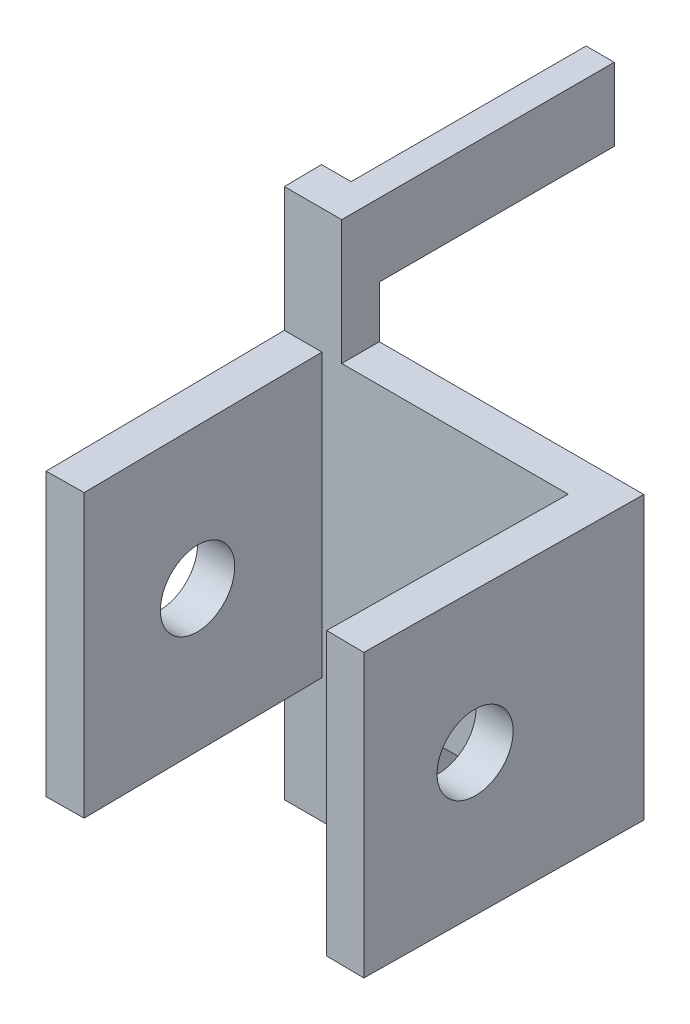
ISO-10303-21;
HEADER;
FILE_DESCRIPTION(('STEP AP214'),'2;1');
FILE_NAME('part.step','',(''),(''),'','','');
FILE_SCHEMA(('AUTOMOTIVE_DESIGN { 1 0 10303 214 1 1 1 1 }'));
ENDSEC;
DATA;
#1=APPLICATION_CONTEXT('core data for automotive mechanical design processes');
#2=APPLICATION_PROTOCOL_DEFINITION('international standard','automotive_design',2000,#1);
#3=PRODUCT_CONTEXT('',#1,'mechanical');
#4=PRODUCT('Part','Part','',(#3));
#5=PRODUCT_RELATED_PRODUCT_CATEGORY('part','',(#4));
#6=PRODUCT_DEFINITION_FORMATION('','',#4);
#7=PRODUCT_DEFINITION_CONTEXT('part definition',#1,'design');
#8=PRODUCT_DEFINITION('design','',#6,#7);
#9=PRODUCT_DEFINITION_SHAPE('','',#8);
#10=(LENGTH_UNIT() NAMED_UNIT(*) SI_UNIT(.MILLI.,.METRE.));
#11=(NAMED_UNIT(*) PLANE_ANGLE_UNIT() SI_UNIT($,.RADIAN.));
#12=(NAMED_UNIT(*) SI_UNIT($,.STERADIAN.) SOLID_ANGLE_UNIT());
#13=UNCERTAINTY_MEASURE_WITH_UNIT(LENGTH_MEASURE(1.E-05),#10,'distance_accuracy_value','');
#14=(GEOMETRIC_REPRESENTATION_CONTEXT(3) GLOBAL_UNCERTAINTY_ASSIGNED_CONTEXT((#13)) GLOBAL_UNIT_ASSIGNED_CONTEXT((#10,
#11,#12)) REPRESENTATION_CONTEXT('',''));
#15=CARTESIAN_POINT('',(0.,0.,0.));
#16=DIRECTION('',(0.,0.,1.));
#17=DIRECTION('',(1.,0.,0.));
#18=AXIS2_PLACEMENT_3D('',#15,#16,#17);
#19=CARTESIAN_POINT('',(0.,30.,0.));
#20=DIRECTION('',(0.,1.,0.));
#21=DIRECTION('',(0.,0.,1.));
#22=AXIS2_PLACEMENT_3D('',#19,#20,#21);
#23=PLANE('',#22);
#24=DIRECTION('',(1.,0.,0.));
#25=VECTOR('',#24,1.);
#26=CARTESIAN_POINT('',(0.,30.,-12.8));
#27=LINE('',#26,#25);
#28=CARTESIAN_POINT('',(-17.1002746487741,30.,-12.8));
#29=VERTEX_POINT('',#28);
#30=CARTESIAN_POINT('',(-13.1,30.,-12.8));
#31=VERTEX_POINT('',#30);
#32=EDGE_CURVE('E210',#29,#31,#27,.T.);
#33=ORIENTED_EDGE('',*,*,#32,.F.);
#34=DIRECTION('',(0.0117179454201639,0.,0.99993134252064));
#35=VECTOR('',#34,1.);
#36=CARTESIAN_POINT('',(-16.7997253700826,30.,12.8468717816807));
#37=LINE('',#36,#35);
#38=CARTESIAN_POINT('',(-16.7997253700826,30.,12.8468717816807));
#39=VERTEX_POINT('',#38);
#40=EDGE_CURVE('E252',#29,#39,#37,.T.);
#41=ORIENTED_EDGE('',*,*,#40,.T.);
#42=DIRECTION('',(0.999931342520641,0.,-0.0117179454201641));
#43=VECTOR('',#42,1.);
#44=CARTESIAN_POINT('',(-16.7997253700826,30.,12.8468717816807));
#45=LINE('',#44,#43);
#46=CARTESIAN_POINT('',(-12.8,30.,12.8));
#47=VERTEX_POINT('',#46);
#48=EDGE_CURVE('E236',#39,#47,#45,.T.);
#49=ORIENTED_EDGE('',*,*,#48,.T.);
#50=DIRECTION('',(-0.0117179454201639,0.,-0.99993134252064));
#51=VECTOR('',#50,1.);
#52=CARTESIAN_POINT('',(-12.8,30.,12.8));
#53=LINE('',#52,#51);
#54=EDGE_CURVE('E239',#47,#31,#53,.T.);
#55=ORIENTED_EDGE('',*,*,#54,.T.);
#56=EDGE_LOOP('',(#33,#41,#49,#55));
#57=FACE_BOUND('',#56,.T.);
#58=ADVANCED_FACE('F33',(#57),#23,.T.);
#59=CARTESIAN_POINT('',(0.,0.,0.));
#60=DIRECTION('',(0.,1.,0.));
#61=DIRECTION('',(0.,0.,1.));
#62=AXIS2_PLACEMENT_3D('',#59,#60,#61);
#63=PLANE('',#62);
#64=DIRECTION('',(0.0117179454201639,0.,0.99993134252064));
#65=VECTOR('',#64,1.);
#66=CARTESIAN_POINT('',(-16.7997253700826,0.,12.8468717816807));
#67=LINE('',#66,#65);
#68=CARTESIAN_POINT('',(-17.1002746487741,0.,-12.8));
#69=VERTEX_POINT('',#68);
#70=CARTESIAN_POINT('',(-16.7997253700826,0.,12.8468717816807));
#71=VERTEX_POINT('',#70);
#72=EDGE_CURVE('E240',#69,#71,#67,.T.);
#73=ORIENTED_EDGE('',*,*,#72,.F.);
#74=DIRECTION('',(1.,0.,0.));
#75=VECTOR('',#74,1.);
#76=CARTESIAN_POINT('',(0.,0.,-12.8));
#77=LINE('',#76,#75);
#78=CARTESIAN_POINT('',(-13.1,0.,-12.8));
#79=VERTEX_POINT('',#78);
#80=EDGE_CURVE('E41',#69,#79,#77,.T.);
#81=ORIENTED_EDGE('',*,*,#80,.T.);
#82=DIRECTION('',(-0.0117179454201639,0.,-0.99993134252064));
#83=VECTOR('',#82,1.);
#84=CARTESIAN_POINT('',(-12.8,0.,12.8));
#85=LINE('',#84,#83);
#86=CARTESIAN_POINT('',(-12.8,0.,12.8));
#87=VERTEX_POINT('',#86);
#88=EDGE_CURVE('E257',#87,#79,#85,.T.);
#89=ORIENTED_EDGE('',*,*,#88,.F.);
#90=DIRECTION('',(0.999931342520641,0.,-0.0117179454201641));
#91=VECTOR('',#90,1.);
#92=CARTESIAN_POINT('',(-16.7997253700826,0.,12.8468717816807));
#93=LINE('',#92,#91);
#94=EDGE_CURVE('E235',#71,#87,#93,.T.);
#95=ORIENTED_EDGE('',*,*,#94,.F.);
#96=EDGE_LOOP('',(#73,#81,#89,#95));
#97=FACE_BOUND('',#96,.T.);
#98=ADVANCED_FACE('F294',(#97),#63,.F.);
#99=CARTESIAN_POINT('',(-13.9998132817287,35.5,-12.8));
#100=DIRECTION('',(-1.,0.,0.));
#101=DIRECTION('',(0.,0.,1.));
#102=AXIS2_PLACEMENT_3D('',#99,#100,#101);
#103=PLANE('',#102);
#104=DIRECTION('',(0.,0.,1.));
#105=VECTOR('',#104,1.);
#106=CARTESIAN_POINT('',(-13.9998132817287,-13.25,-41.8));
#107=LINE('',#106,#105);
#108=CARTESIAN_POINT('',(-13.9998132817287,-13.25,-41.8));
#109=VERTEX_POINT('',#108);
#110=CARTESIAN_POINT('',(-13.9998132817287,-13.25,-16.8));
#111=VERTEX_POINT('',#110);
#112=EDGE_CURVE('E55',#109,#111,#107,.T.);
#113=ORIENTED_EDGE('',*,*,#112,.T.);
#114=DIRECTION('',(0.,-1.,0.));
#115=VECTOR('',#114,1.);
#116=CARTESIAN_POINT('',(-13.9998132817287,43.25,-16.8));
#117=LINE('',#116,#115);
#118=CARTESIAN_POINT('',(-13.9998132817287,-5.5,-16.8));
#119=VERTEX_POINT('',#118);
#120=EDGE_CURVE('E193',#119,#111,#117,.T.);
#121=ORIENTED_EDGE('',*,*,#120,.F.);
#122=DIRECTION('',(0.,0.,1.));
#123=VECTOR('',#122,1.);
#124=CARTESIAN_POINT('',(-13.9998132817287,-5.50000000000001,-41.8));
#125=LINE('',#124,#123);
#126=CARTESIAN_POINT('',(-13.9998132817287,-5.50000000000001,-41.8));
#127=VERTEX_POINT('',#126);
#128=EDGE_CURVE('E336',#127,#119,#125,.T.);
#129=ORIENTED_EDGE('',*,*,#128,.F.);
#130=DIRECTION('',(0.,1.,0.));
#131=VECTOR('',#130,1.);
#132=CARTESIAN_POINT('',(-13.9998132817287,-5.50000000000001,-41.8));
#133=LINE('',#132,#131);
#134=EDGE_CURVE('E329',#109,#127,#133,.T.);
#135=ORIENTED_EDGE('',*,*,#134,.F.);
#136=EDGE_LOOP('',(#113,#121,#129,#135));
#137=FACE_BOUND('',#136,.T.);
#138=ADVANCED_FACE('F417',(#137),#103,.T.);
#139=DIRECTION('',(0.,0.,1.));
#140=VECTOR('',#139,1.);
#141=CARTESIAN_POINT('',(-13.9998132817287,35.5,-41.8));
#142=LINE('',#141,#140);
#143=CARTESIAN_POINT('',(-13.9998132817287,35.5,-41.8));
#144=VERTEX_POINT('',#143);
#145=CARTESIAN_POINT('',(-13.9998132817287,35.5,-16.8));
#146=VERTEX_POINT('',#145);
#147=EDGE_CURVE('E192',#144,#146,#142,.T.);
#148=ORIENTED_EDGE('',*,*,#147,.T.);
#149=CARTESIAN_POINT('',(-13.9998132817287,43.25,-16.8));
#150=VERTEX_POINT('',#149);
#151=EDGE_CURVE('E174',#150,#146,#117,.T.);
#152=ORIENTED_EDGE('',*,*,#151,.F.);
#153=DIRECTION('',(0.,0.,1.));
#154=VECTOR('',#153,1.);
#155=CARTESIAN_POINT('',(-13.9998132817287,43.25,-41.8));
#156=LINE('',#155,#154);
#157=CARTESIAN_POINT('',(-13.9998132817287,43.25,-41.8));
#158=VERTEX_POINT('',#157);
#159=EDGE_CURVE('E189',#158,#150,#156,.T.);
#160=ORIENTED_EDGE('',*,*,#159,.F.);
#161=DIRECTION('',(0.,1.,0.));
#162=VECTOR('',#161,1.);
#163=CARTESIAN_POINT('',(-13.9998132817287,35.5,-41.8));
#164=LINE('',#163,#162);
#165=EDGE_CURVE('E349',#144,#158,#164,.T.);
#166=ORIENTED_EDGE('',*,*,#165,.F.);
#167=EDGE_LOOP('',(#148,#152,#160,#166));
#168=FACE_BOUND('',#167,.T.);
#169=ADVANCED_FACE('F188',(#168),#103,.T.);
#170=DIRECTION('',(0.,0.,-1.));
#171=VECTOR('',#170,1.);
#172=CARTESIAN_POINT('',(-10.9998132817287,30.,0.));
#173=LINE('',#172,#171);
#174=CARTESIAN_POINT('',(-10.9998132817287,30.,-12.8));
#175=VERTEX_POINT('',#174);
#176=CARTESIAN_POINT('',(-10.9998132817287,30.,-16.8));
#177=VERTEX_POINT('',#176);
#178=EDGE_CURVE('E222',#175,#177,#173,.T.);
#179=ORIENTED_EDGE('',*,*,#178,.F.);
#180=DIRECTION('',(1.,0.,0.));
#181=VECTOR('',#180,1.);
#182=CARTESIAN_POINT('',(-13.1,30.,-12.8));
#183=LINE('',#182,#181);
#184=CARTESIAN_POINT('',(13.1,30.,-12.8));
#185=VERTEX_POINT('',#184);
#186=EDGE_CURVE('E242',#175,#185,#183,.T.);
#187=ORIENTED_EDGE('',*,*,#186,.T.);
#188=DIRECTION('',(-0.0118101998876842,0.,0.999930257157274));
#189=VECTOR('',#188,1.);
#190=CARTESIAN_POINT('',(13.1,30.,-12.8));
#191=LINE('',#190,#189);
#192=CARTESIAN_POINT('',(12.8,30.,12.6));
#193=VERTEX_POINT('',#192);
#194=EDGE_CURVE('E244',#185,#193,#191,.T.);
#195=ORIENTED_EDGE('',*,*,#194,.T.);
#196=DIRECTION('',(0.999930257157274,0.,0.0118101998876842));
#197=VECTOR('',#196,1.);
#198=CARTESIAN_POINT('',(12.8,30.,12.6));
#199=LINE('',#198,#197);
#200=CARTESIAN_POINT('',(16.7997210286291,30.,12.6472407995507));
#201=VERTEX_POINT('',#200);
#202=EDGE_CURVE('E246',#193,#201,#199,.T.);
#203=ORIENTED_EDGE('',*,*,#202,.T.);
#204=DIRECTION('',(0.0118101998876842,0.,-0.999930257157274));
#205=VECTOR('',#204,1.);
#206=CARTESIAN_POINT('',(17.1475230853167,30.,-16.8));
#207=LINE('',#206,#205);
#208=CARTESIAN_POINT('',(17.1475230853167,30.,-16.8));
#209=VERTEX_POINT('',#208);
#210=EDGE_CURVE('E248',#201,#209,#207,.T.);
#211=ORIENTED_EDGE('',*,*,#210,.T.);
#212=DIRECTION('',(-1.,0.,0.));
#213=VECTOR('',#212,1.);
#214=CARTESIAN_POINT('',(-17.1471496487741,30.,-16.8));
#215=LINE('',#214,#213);
#216=EDGE_CURVE('E250',#209,#177,#215,.T.);
#217=ORIENTED_EDGE('',*,*,#216,.T.);
#218=EDGE_LOOP('',(#179,#187,#195,#203,#211,#217));
#219=FACE_BOUND('',#218,.T.);
#220=ADVANCED_FACE('F363',(#219),#23,.T.);
#221=DIRECTION('',(1.,0.,0.));
#222=VECTOR('',#221,1.);
#223=CARTESIAN_POINT('',(-13.1,0.,-12.8));
#224=LINE('',#223,#222);
#225=CARTESIAN_POINT('',(-10.9998132817287,0.,-12.8));
#226=VERTEX_POINT('',#225);
#227=CARTESIAN_POINT('',(13.1,0.,-12.8));
#228=VERTEX_POINT('',#227);
#229=EDGE_CURVE('E260',#226,#228,#224,.T.);
#230=ORIENTED_EDGE('',*,*,#229,.F.);
#231=DIRECTION('',(0.,0.,-1.));
#232=VECTOR('',#231,1.);
#233=CARTESIAN_POINT('',(-10.9998132817287,0.,0.));
#234=LINE('',#233,#232);
#235=CARTESIAN_POINT('',(-10.9998132817287,0.,-16.8));
#236=VERTEX_POINT('',#235);
#237=EDGE_CURVE('E11',#226,#236,#234,.T.);
#238=ORIENTED_EDGE('',*,*,#237,.T.);
#239=DIRECTION('',(-1.,0.,0.));
#240=VECTOR('',#239,1.);
#241=CARTESIAN_POINT('',(-17.1471496487741,0.,-16.8));
#242=LINE('',#241,#240);
#243=CARTESIAN_POINT('',(17.1475230853167,0.,-16.8));
#244=VERTEX_POINT('',#243);
#245=EDGE_CURVE('E268',#244,#236,#242,.T.);
#246=ORIENTED_EDGE('',*,*,#245,.F.);
#247=DIRECTION('',(0.0118101998876842,0.,-0.999930257157274));
#248=VECTOR('',#247,1.);
#249=CARTESIAN_POINT('',(17.1475230853167,0.,-16.8));
#250=LINE('',#249,#248);
#251=CARTESIAN_POINT('',(16.7997210286291,0.,12.6472407995507));
#252=VERTEX_POINT('',#251);
#253=EDGE_CURVE('E266',#252,#244,#250,.T.);
#254=ORIENTED_EDGE('',*,*,#253,.F.);
#255=DIRECTION('',(0.999930257157274,0.,0.0118101998876842));
#256=VECTOR('',#255,1.);
#257=CARTESIAN_POINT('',(12.8,0.,12.6));
#258=LINE('',#257,#256);
#259=CARTESIAN_POINT('',(12.8,0.,12.6));
#260=VERTEX_POINT('',#259);
#261=EDGE_CURVE('E264',#260,#252,#258,.T.);
#262=ORIENTED_EDGE('',*,*,#261,.F.);
#263=DIRECTION('',(-0.0118101998876842,0.,0.999930257157274));
#264=VECTOR('',#263,1.);
#265=CARTESIAN_POINT('',(13.1,0.,-12.8));
#266=LINE('',#265,#264);
#267=EDGE_CURVE('E262',#228,#260,#266,.T.);
#268=ORIENTED_EDGE('',*,*,#267,.F.);
#269=EDGE_LOOP('',(#230,#238,#246,#254,#262,#268));
#270=FACE_BOUND('',#269,.T.);
#271=ADVANCED_FACE('F385',(#270),#63,.F.);
#272=CARTESIAN_POINT('',(-16.7997253700826,30.,12.8468717816807));
#273=DIRECTION('',(-0.0117179454201641,0.,-0.99993134252064));
#274=DIRECTION('',(-0.99993134252064,0.,0.0117179454201641));
#275=AXIS2_PLACEMENT_3D('',#272,#273,#274);
#276=PLANE('',#275);
#277=ORIENTED_EDGE('',*,*,#94,.T.);
#278=DIRECTION('',(0.,-1.,0.));
#279=VECTOR('',#278,1.);
#280=CARTESIAN_POINT('',(-12.8,30.,12.8));
#281=LINE('',#280,#279);
#282=EDGE_CURVE('E289',#47,#87,#281,.T.);
#283=ORIENTED_EDGE('',*,*,#282,.F.);
#284=ORIENTED_EDGE('',*,*,#48,.F.);
#285=DIRECTION('',(0.,-1.,0.));
#286=VECTOR('',#285,1.);
#287=CARTESIAN_POINT('',(-16.7997253700826,30.,12.8468717816807));
#288=LINE('',#287,#286);
#289=EDGE_CURVE('E254',#39,#71,#288,.T.);
#290=ORIENTED_EDGE('',*,*,#289,.T.);
#291=EDGE_LOOP('',(#277,#283,#284,#290));
#292=FACE_BOUND('',#291,.T.);
#293=ADVANCED_FACE('F35',(#292),#276,.F.);
#294=CARTESIAN_POINT('',(-12.8,30.,12.8));
#295=DIRECTION('',(-0.99993134252064,0.,0.0117179454201639));
#296=DIRECTION('',(0.0117179454201639,0.,0.99993134252064));
#297=AXIS2_PLACEMENT_3D('',#294,#295,#296);
#298=PLANE('',#297);
#299=CARTESIAN_POINT('',(-12.9430257914129,15.,0.595132466101247));
#300=DIRECTION('',(-0.99993134252064,0.,0.0117179454201639));
#301=DIRECTION('',(0.0117179454201639,0.,0.99993134252064));
#302=AXIS2_PLACEMENT_3D('',#299,#300,#301);
#303=ELLIPSE('',#302,4.00110745377421,4.);
#304=CARTESIAN_POINT('',(-12.8961410326493,15.,4.59596521392304));
#305=VERTEX_POINT('',#304);
#306=EDGE_CURVE('E232',#305,#305,#303,.T.);
#307=ORIENTED_EDGE('',*,*,#306,.T.);
#308=EDGE_LOOP('',(#307));
#309=FACE_BOUND('',#308,.T.);
#310=ORIENTED_EDGE('',*,*,#88,.T.);
#311=DIRECTION('',(0.,-1.,0.));
#312=VECTOR('',#311,1.);
#313=CARTESIAN_POINT('',(-13.1,30.,-12.8));
#314=LINE('',#313,#312);
#315=EDGE_CURVE('E287',#31,#79,#314,.T.);
#316=ORIENTED_EDGE('',*,*,#315,.F.);
#317=ORIENTED_EDGE('',*,*,#54,.F.);
#318=ORIENTED_EDGE('',*,*,#282,.T.);
#319=EDGE_LOOP('',(#310,#316,#317,#318));
#320=FACE_BOUND('',#319,.T.);
#321=ADVANCED_FACE('F299',(#309,#320),#298,.F.);
#322=CARTESIAN_POINT('',(-13.1,30.,-12.8));
#323=DIRECTION('',(0.,0.,-1.));
#324=DIRECTION('',(-1.,0.,0.));
#325=AXIS2_PLACEMENT_3D('',#322,#323,#324);
#326=PLANE('',#325);
#327=ORIENTED_EDGE('',*,*,#186,.F.);
#328=DIRECTION('',(0.,-1.,0.));
#329=VECTOR('',#328,1.);
#330=CARTESIAN_POINT('',(-10.9998132817287,-5.5,-12.8));
#331=LINE('',#330,#329);
#332=CARTESIAN_POINT('',(-10.9998132817287,43.25,-12.8));
#333=VERTEX_POINT('',#332);
#334=EDGE_CURVE('E207',#333,#175,#331,.T.);
#335=ORIENTED_EDGE('',*,*,#334,.F.);
#336=DIRECTION('',(1.,0.,0.));
#337=VECTOR('',#336,1.);
#338=CARTESIAN_POINT('',(-10.9998132817287,43.25,-12.8));
#339=LINE('',#338,#337);
#340=CARTESIAN_POINT('',(-17.1002746487741,43.25,-12.8));
#341=VERTEX_POINT('',#340);
#342=EDGE_CURVE('E343',#341,#333,#339,.T.);
#343=ORIENTED_EDGE('',*,*,#342,.F.);
#344=DIRECTION('',(0.,-1.,0.));
#345=VECTOR('',#344,1.);
#346=CARTESIAN_POINT('',(-17.1002746487741,-13.25,-12.8));
#347=LINE('',#346,#345);
#348=EDGE_CURVE('E305',#341,#29,#347,.T.);
#349=ORIENTED_EDGE('',*,*,#348,.T.);
#350=ORIENTED_EDGE('',*,*,#32,.T.);
#351=ORIENTED_EDGE('',*,*,#315,.T.);
#352=ORIENTED_EDGE('',*,*,#80,.F.);
#353=CARTESIAN_POINT('',(-17.1002746487741,-13.25,-12.8));
#354=VERTEX_POINT('',#353);
#355=EDGE_CURVE('E182',#69,#354,#347,.T.);
#356=ORIENTED_EDGE('',*,*,#355,.T.);
#357=DIRECTION('',(-1.,0.,0.));
#358=VECTOR('',#357,1.);
#359=CARTESIAN_POINT('',(-10.9998132817287,-13.25,-12.8));
#360=LINE('',#359,#358);
#361=CARTESIAN_POINT('',(-10.9998132817287,-13.25,-12.8));
#362=VERTEX_POINT('',#361);
#363=EDGE_CURVE('E321',#362,#354,#360,.T.);
#364=ORIENTED_EDGE('',*,*,#363,.F.);
#365=EDGE_CURVE('E211',#226,#362,#331,.T.);
#366=ORIENTED_EDGE('',*,*,#365,.F.);
#367=ORIENTED_EDGE('',*,*,#229,.T.);
#368=DIRECTION('',(0.,-1.,0.));
#369=VECTOR('',#368,1.);
#370=CARTESIAN_POINT('',(13.1,30.,-12.8));
#371=LINE('',#370,#369);
#372=EDGE_CURVE('E284',#185,#228,#371,.T.);
#373=ORIENTED_EDGE('',*,*,#372,.F.);
#374=EDGE_LOOP('',(#327,#335,#343,#349,#350,#351,#352,#356,#364,#366,#367,#373));
#375=FACE_BOUND('',#374,.T.);
#376=ADVANCED_FACE('F302',(#375),#326,.F.);
#377=CARTESIAN_POINT('',(13.1,30.,-12.8));
#378=DIRECTION('',(0.999930257157274,0.,0.0118101998876842));
#379=DIRECTION('',(0.0118101998876842,0.,-0.999930257157275));
#380=AXIS2_PLACEMENT_3D('',#377,#378,#379);
#381=PLANE('',#380);
#382=CARTESIAN_POINT('',(12.9381793386859,15.,0.900815991259892));
#383=DIRECTION('',(0.999930257157274,0.,0.0118101998876842));
#384=DIRECTION('',(0.0118101998876842,0.,-0.999930257157275));
#385=AXIS2_PLACEMENT_3D('',#382,#383,#384);
#386=CIRCLE('',#385,4.);
#387=CARTESIAN_POINT('',(12.9854201382366,15.,-3.09890503736921));
#388=VERTEX_POINT('',#387);
#389=EDGE_CURVE('E229',#388,#388,#386,.T.);
#390=ORIENTED_EDGE('',*,*,#389,.T.);
#391=EDGE_LOOP('',(#390));
#392=FACE_BOUND('',#391,.T.);
#393=ORIENTED_EDGE('',*,*,#267,.T.);
#394=DIRECTION('',(0.,-1.,0.));
#395=VECTOR('',#394,1.);
#396=CARTESIAN_POINT('',(12.8,30.,12.6));
#397=LINE('',#396,#395);
#398=EDGE_CURVE('E281',#193,#260,#397,.T.);
#399=ORIENTED_EDGE('',*,*,#398,.F.);
#400=ORIENTED_EDGE('',*,*,#194,.F.);
#401=ORIENTED_EDGE('',*,*,#372,.T.);
#402=EDGE_LOOP('',(#393,#399,#400,#401));
#403=FACE_BOUND('',#402,.T.);
#404=ADVANCED_FACE('F371',(#392,#403),#381,.F.);
#405=CARTESIAN_POINT('',(12.8,30.,12.6));
#406=DIRECTION('',(0.0118101998876842,0.,-0.999930257157274));
#407=DIRECTION('',(-0.999930257157275,0.,-0.0118101998876842));
#408=AXIS2_PLACEMENT_3D('',#405,#406,#407);
#409=PLANE('',#408);
#410=ORIENTED_EDGE('',*,*,#261,.T.);
#411=DIRECTION('',(0.,-1.,0.));
#412=VECTOR('',#411,1.);
#413=CARTESIAN_POINT('',(16.7997210286291,30.,12.6472407995507));
#414=LINE('',#413,#412);
#415=EDGE_CURVE('E278',#201,#252,#414,.T.);
#416=ORIENTED_EDGE('',*,*,#415,.F.);
#417=ORIENTED_EDGE('',*,*,#202,.F.);
#418=ORIENTED_EDGE('',*,*,#398,.T.);
#419=EDGE_LOOP('',(#410,#416,#417,#418));
#420=FACE_BOUND('',#419,.T.);
#421=ADVANCED_FACE('F377',(#420),#409,.F.);
#422=CARTESIAN_POINT('',(17.1475230853167,30.,-16.8));
#423=DIRECTION('',(-0.999930257157274,0.,-0.0118101998876842));
#424=DIRECTION('',(-0.0118101998876842,0.,0.999930257157275));
#425=AXIS2_PLACEMENT_3D('',#422,#423,#424);
#426=PLANE('',#425);
#427=CARTESIAN_POINT('',(16.937900367315,15.,0.948056790810628));
#428=DIRECTION('',(0.999930257157274,0.,0.0118101998876842));
#429=DIRECTION('',(0.0118101998876842,0.,-0.999930257157274));
#430=AXIS2_PLACEMENT_3D('',#427,#428,#429);
#431=CIRCLE('',#430,4.);
#432=CARTESIAN_POINT('',(16.9851411668657,15.,-3.05166423781847));
#433=VERTEX_POINT('',#432);
#434=EDGE_CURVE('E225',#433,#433,#431,.T.);
#435=ORIENTED_EDGE('',*,*,#434,.F.);
#436=EDGE_LOOP('',(#435));
#437=FACE_BOUND('',#436,.T.);
#438=ORIENTED_EDGE('',*,*,#253,.T.);
#439=DIRECTION('',(0.,-1.,0.));
#440=VECTOR('',#439,1.);
#441=CARTESIAN_POINT('',(17.1475230853167,30.,-16.8));
#442=LINE('',#441,#440);
#443=EDGE_CURVE('E275',#209,#244,#442,.T.);
#444=ORIENTED_EDGE('',*,*,#443,.F.);
#445=ORIENTED_EDGE('',*,*,#210,.F.);
#446=ORIENTED_EDGE('',*,*,#415,.T.);
#447=EDGE_LOOP('',(#438,#444,#445,#446));
#448=FACE_BOUND('',#447,.T.);
#449=ADVANCED_FACE('F381',(#437,#448),#426,.F.);
#450=CARTESIAN_POINT('',(-17.1471496487741,30.,-16.8));
#451=DIRECTION('',(0.,0.,1.));
#452=DIRECTION('',(1.,0.,0.));
#453=AXIS2_PLACEMENT_3D('',#450,#451,#452);
#454=PLANE('',#453);
#455=DIRECTION('',(0.,-1.,0.));
#456=VECTOR('',#455,1.);
#457=CARTESIAN_POINT('',(-17.1471496487741,30.,-16.8));
#458=LINE('',#457,#456);
#459=CARTESIAN_POINT('',(-17.1471496487741,43.25,-16.8));
#460=VERTEX_POINT('',#459);
#461=CARTESIAN_POINT('',(-17.1471496487741,-13.25,-16.8));
#462=VERTEX_POINT('',#461);
#463=EDGE_CURVE('E177',#460,#462,#458,.T.);
#464=ORIENTED_EDGE('',*,*,#463,.F.);
#465=DIRECTION('',(1.,0.,0.));
#466=VECTOR('',#465,1.);
#467=CARTESIAN_POINT('',(-73.7670726534593,43.25,-16.8));
#468=LINE('',#467,#466);
#469=EDGE_CURVE('E170',#460,#150,#468,.T.);
#470=ORIENTED_EDGE('',*,*,#469,.T.);
#471=ORIENTED_EDGE('',*,*,#151,.T.);
#472=DIRECTION('',(1.,0.,0.));
#473=VECTOR('',#472,1.);
#474=CARTESIAN_POINT('',(-10.9998132817287,35.5,-16.8));
#475=LINE('',#474,#473);
#476=CARTESIAN_POINT('',(-10.9998132817287,35.5,-16.8));
#477=VERTEX_POINT('',#476);
#478=EDGE_CURVE('E214',#146,#477,#475,.T.);
#479=ORIENTED_EDGE('',*,*,#478,.T.);
#480=DIRECTION('',(0.,-1.,0.));
#481=VECTOR('',#480,1.);
#482=CARTESIAN_POINT('',(-10.9998132817287,-5.5,-16.8));
#483=LINE('',#482,#481);
#484=EDGE_CURVE('E217',#477,#177,#483,.T.);
#485=ORIENTED_EDGE('',*,*,#484,.T.);
#486=ORIENTED_EDGE('',*,*,#216,.F.);
#487=ORIENTED_EDGE('',*,*,#443,.T.);
#488=ORIENTED_EDGE('',*,*,#245,.T.);
#489=CARTESIAN_POINT('',(-10.9998132817287,-5.50000000000001,-16.8));
#490=VERTEX_POINT('',#489);
#491=EDGE_CURVE('E216',#236,#490,#483,.T.);
#492=ORIENTED_EDGE('',*,*,#491,.T.);
#493=DIRECTION('',(-1.,0.,0.));
#494=VECTOR('',#493,1.);
#495=CARTESIAN_POINT('',(-10.9998132817287,-5.5,-16.8));
#496=LINE('',#495,#494);
#497=EDGE_CURVE('E200',#490,#119,#496,.T.);
#498=ORIENTED_EDGE('',*,*,#497,.T.);
#499=ORIENTED_EDGE('',*,*,#120,.T.);
#500=DIRECTION('',(1.,0.,0.));
#501=VECTOR('',#500,1.);
#502=CARTESIAN_POINT('',(-73.7670726534593,-13.25,-16.8));
#503=LINE('',#502,#501);
#504=EDGE_CURVE('E183',#462,#111,#503,.T.);
#505=ORIENTED_EDGE('',*,*,#504,.F.);
#506=EDGE_LOOP('',(#464,#470,#471,#479,#485,#486,#487,#488,#492,#498,#499,#505));
#507=FACE_BOUND('',#506,.T.);
#508=ADVANCED_FACE('F172',(#507),#454,.F.);
#509=CARTESIAN_POINT('',(-16.7997253700826,30.,12.8468717816807));
#510=DIRECTION('',(0.99993134252064,0.,-0.0117179454201639));
#511=DIRECTION('',(-0.0117179454201639,0.,-0.99993134252064));
#512=AXIS2_PLACEMENT_3D('',#509,#510,#511);
#513=PLANE('',#512);
#514=ORIENTED_EDGE('',*,*,#463,.T.);
#515=DIRECTION('',(-0.0117179454201639,0.,-0.99993134252064));
#516=VECTOR('',#515,1.);
#517=CARTESIAN_POINT('',(-17.1080555806842,-13.25,-13.4639728563216));
#518=LINE('',#517,#516);
#519=EDGE_CURVE('E316',#354,#462,#518,.T.);
#520=ORIENTED_EDGE('',*,*,#519,.F.);
#521=ORIENTED_EDGE('',*,*,#355,.F.);
#522=ORIENTED_EDGE('',*,*,#72,.T.);
#523=ORIENTED_EDGE('',*,*,#289,.F.);
#524=ORIENTED_EDGE('',*,*,#40,.F.);
#525=ORIENTED_EDGE('',*,*,#348,.F.);
#526=DIRECTION('',(0.0117179454201639,0.,0.99993134252064));
#527=VECTOR('',#526,1.);
#528=CARTESIAN_POINT('',(-17.1080555806842,43.25,-13.4639728563216));
#529=LINE('',#528,#527);
#530=EDGE_CURVE('E324',#460,#341,#529,.T.);
#531=ORIENTED_EDGE('',*,*,#530,.F.);
#532=EDGE_LOOP('',(#514,#520,#521,#522,#523,#524,#525,#531));
#533=FACE_BOUND('',#532,.T.);
#534=CARTESIAN_POINT('',(-16.9438541965792,15.,0.547878587300071));
#535=DIRECTION('',(0.99993134252064,0.,-0.0117179454201639));
#536=DIRECTION('',(0.0117179454201639,0.,0.99993134252064));
#537=AXIS2_PLACEMENT_3D('',#534,#535,#536);
#538=ELLIPSE('',#537,4.00110745377421,4.);
#539=CARTESIAN_POINT('',(-16.8969694378157,15.,4.54871133512186));
#540=VERTEX_POINT('',#539);
#541=EDGE_CURVE('E228',#540,#540,#538,.T.);
#542=ORIENTED_EDGE('',*,*,#541,.T.);
#543=EDGE_LOOP('',(#542));
#544=FACE_BOUND('',#543,.T.);
#545=ADVANCED_FACE('F312',(#533,#544),#513,.F.);
#546=CARTESIAN_POINT('',(-23.059309918976,15.,0.475648795303259));
#547=DIRECTION('',(0.999930257157274,0.,0.0118101998876842));
#548=DIRECTION('',(0.0118101998876842,0.,-0.999930257157275));
#549=AXIS2_PLACEMENT_3D('',#546,#547,#548);
#550=CYLINDRICAL_SURFACE('',#549,4.);
#551=ORIENTED_EDGE('',*,*,#541,.F.);
#552=EDGE_LOOP('',(#551));
#553=FACE_BOUND('',#552,.T.);
#554=ORIENTED_EDGE('',*,*,#306,.F.);
#555=EDGE_LOOP('',(#554));
#556=FACE_BOUND('',#555,.T.);
#557=ADVANCED_FACE('F431',(#553,#556),#550,.F.);
#558=ORIENTED_EDGE('',*,*,#434,.T.);
#559=EDGE_LOOP('',(#558));
#560=FACE_BOUND('',#559,.T.);
#561=ORIENTED_EDGE('',*,*,#389,.F.);
#562=EDGE_LOOP('',(#561));
#563=FACE_BOUND('',#562,.T.);
#564=ADVANCED_FACE('F433',(#560,#563),#550,.F.);
#565=CARTESIAN_POINT('',(-10.9998132817287,-5.5,-12.8));
#566=DIRECTION('',(1.,0.,0.));
#567=DIRECTION('',(0.,1.,0.));
#568=AXIS2_PLACEMENT_3D('',#565,#566,#567);
#569=PLANE('',#568);
#570=ORIENTED_EDGE('',*,*,#237,.F.);
#571=ORIENTED_EDGE('',*,*,#365,.T.);
#572=DIRECTION('',(0.,0.,1.));
#573=VECTOR('',#572,1.);
#574=CARTESIAN_POINT('',(-10.9998132817287,-13.25,-41.8));
#575=LINE('',#574,#573);
#576=CARTESIAN_POINT('',(-10.9998132817287,-13.25,-41.8));
#577=VERTEX_POINT('',#576);
#578=EDGE_CURVE('E340',#577,#362,#575,.T.);
#579=ORIENTED_EDGE('',*,*,#578,.F.);
#580=DIRECTION('',(0.,-1.,0.));
#581=VECTOR('',#580,1.);
#582=CARTESIAN_POINT('',(-10.9998132817287,-5.50000000000001,-41.8));
#583=LINE('',#582,#581);
#584=CARTESIAN_POINT('',(-10.9998132817287,-5.50000000000001,-41.8));
#585=VERTEX_POINT('',#584);
#586=EDGE_CURVE('E323',#585,#577,#583,.T.);
#587=ORIENTED_EDGE('',*,*,#586,.F.);
#588=DIRECTION('',(0.,0.,1.));
#589=VECTOR('',#588,1.);
#590=CARTESIAN_POINT('',(-10.9998132817287,-5.50000000000001,-41.8));
#591=LINE('',#590,#589);
#592=EDGE_CURVE('E333',#585,#490,#591,.T.);
#593=ORIENTED_EDGE('',*,*,#592,.T.);
#594=ORIENTED_EDGE('',*,*,#491,.F.);
#595=EDGE_LOOP('',(#570,#571,#579,#587,#593,#594));
#596=FACE_BOUND('',#595,.T.);
#597=ADVANCED_FACE('F387',(#596),#569,.T.);
#598=ORIENTED_EDGE('',*,*,#334,.T.);
#599=ORIENTED_EDGE('',*,*,#178,.T.);
#600=ORIENTED_EDGE('',*,*,#484,.F.);
#601=DIRECTION('',(0.,0.,1.));
#602=VECTOR('',#601,1.);
#603=CARTESIAN_POINT('',(-10.9998132817287,35.5,-41.8));
#604=LINE('',#603,#602);
#605=CARTESIAN_POINT('',(-10.9998132817287,35.5,-41.8));
#606=VERTEX_POINT('',#605);
#607=EDGE_CURVE('E203',#606,#477,#604,.T.);
#608=ORIENTED_EDGE('',*,*,#607,.F.);
#609=DIRECTION('',(0.,-1.,0.));
#610=VECTOR('',#609,1.);
#611=CARTESIAN_POINT('',(-10.9998132817287,35.5,-41.8));
#612=LINE('',#611,#610);
#613=CARTESIAN_POINT('',(-10.9998132817287,43.25,-41.8));
#614=VERTEX_POINT('',#613);
#615=EDGE_CURVE('E352',#614,#606,#612,.T.);
#616=ORIENTED_EDGE('',*,*,#615,.F.);
#617=DIRECTION('',(0.,0.,1.));
#618=VECTOR('',#617,1.);
#619=CARTESIAN_POINT('',(-10.9998132817287,43.25,-41.8));
#620=LINE('',#619,#618);
#621=EDGE_CURVE('E198',#614,#333,#620,.T.);
#622=ORIENTED_EDGE('',*,*,#621,.T.);
#623=EDGE_LOOP('',(#598,#599,#600,#608,#616,#622));
#624=FACE_BOUND('',#623,.T.);
#625=ADVANCED_FACE('F361',(#624),#569,.T.);
#626=CARTESIAN_POINT('',(-10.9998132817287,35.5,-41.8));
#627=DIRECTION('',(0.,1.,0.));
#628=DIRECTION('',(0.,0.,1.));
#629=AXIS2_PLACEMENT_3D('',#626,#627,#628);
#630=PLANE('',#629);
#631=ORIENTED_EDGE('',*,*,#478,.F.);
#632=ORIENTED_EDGE('',*,*,#147,.F.);
#633=DIRECTION('',(-1.,0.,0.));
#634=VECTOR('',#633,1.);
#635=CARTESIAN_POINT('',(-10.9998132817287,35.5,-41.8));
#636=LINE('',#635,#634);
#637=EDGE_CURVE('E346',#606,#144,#636,.T.);
#638=ORIENTED_EDGE('',*,*,#637,.F.);
#639=ORIENTED_EDGE('',*,*,#607,.T.);
#640=EDGE_LOOP('',(#631,#632,#638,#639));
#641=FACE_BOUND('',#640,.T.);
#642=ADVANCED_FACE('F356',(#641),#630,.F.);
#643=CARTESIAN_POINT('',(-10.9998132817287,43.25,-41.8));
#644=DIRECTION('',(0.,-1.,0.));
#645=DIRECTION('',(0.,0.,-1.));
#646=AXIS2_PLACEMENT_3D('',#643,#644,#645);
#647=PLANE('',#646);
#648=ORIENTED_EDGE('',*,*,#159,.T.);
#649=ORIENTED_EDGE('',*,*,#469,.F.);
#650=ORIENTED_EDGE('',*,*,#530,.T.);
#651=ORIENTED_EDGE('',*,*,#342,.T.);
#652=ORIENTED_EDGE('',*,*,#621,.F.);
#653=DIRECTION('',(1.,0.,0.));
#654=VECTOR('',#653,1.);
#655=CARTESIAN_POINT('',(-10.9998132817287,43.25,-41.8));
#656=LINE('',#655,#654);
#657=EDGE_CURVE('E197',#158,#614,#656,.T.);
#658=ORIENTED_EDGE('',*,*,#657,.F.);
#659=EDGE_LOOP('',(#648,#649,#650,#651,#652,#658));
#660=FACE_BOUND('',#659,.T.);
#661=ADVANCED_FACE('F195',(#660),#647,.F.);
#662=CARTESIAN_POINT('',(0.,0.,-41.8));
#663=DIRECTION('',(0.,0.,-1.));
#664=DIRECTION('',(-1.,0.,0.));
#665=AXIS2_PLACEMENT_3D('',#662,#663,#664);
#666=PLANE('',#665);
#667=ORIENTED_EDGE('',*,*,#637,.T.);
#668=ORIENTED_EDGE('',*,*,#165,.T.);
#669=ORIENTED_EDGE('',*,*,#657,.T.);
#670=ORIENTED_EDGE('',*,*,#615,.T.);
#671=EDGE_LOOP('',(#667,#668,#669,#670));
#672=FACE_BOUND('',#671,.T.);
#673=ADVANCED_FACE('F403',(#672),#666,.T.);
#674=CARTESIAN_POINT('',(-10.9998132817287,-13.25,-41.8));
#675=DIRECTION('',(0.,1.,0.));
#676=DIRECTION('',(0.,0.,1.));
#677=AXIS2_PLACEMENT_3D('',#674,#675,#676);
#678=PLANE('',#677);
#679=ORIENTED_EDGE('',*,*,#578,.T.);
#680=ORIENTED_EDGE('',*,*,#363,.T.);
#681=ORIENTED_EDGE('',*,*,#519,.T.);
#682=ORIENTED_EDGE('',*,*,#504,.T.);
#683=ORIENTED_EDGE('',*,*,#112,.F.);
#684=DIRECTION('',(-1.,0.,0.));
#685=VECTOR('',#684,1.);
#686=CARTESIAN_POINT('',(-10.9998132817287,-13.25,-41.8));
#687=LINE('',#686,#685);
#688=EDGE_CURVE('E327',#577,#109,#687,.T.);
#689=ORIENTED_EDGE('',*,*,#688,.F.);
#690=EDGE_LOOP('',(#679,#680,#681,#682,#683,#689));
#691=FACE_BOUND('',#690,.T.);
#692=ADVANCED_FACE('F390',(#691),#678,.F.);
#693=CARTESIAN_POINT('',(-10.9998132817287,-5.50000000000001,-41.8));
#694=DIRECTION('',(0.,-1.,0.));
#695=DIRECTION('',(0.,0.,-1.));
#696=AXIS2_PLACEMENT_3D('',#693,#694,#695);
#697=PLANE('',#696);
#698=ORIENTED_EDGE('',*,*,#497,.F.);
#699=ORIENTED_EDGE('',*,*,#592,.F.);
#700=DIRECTION('',(1.,0.,0.));
#701=VECTOR('',#700,1.);
#702=CARTESIAN_POINT('',(-10.9998132817287,-5.50000000000001,-41.8));
#703=LINE('',#702,#701);
#704=EDGE_CURVE('E331',#127,#585,#703,.T.);
#705=ORIENTED_EDGE('',*,*,#704,.F.);
#706=ORIENTED_EDGE('',*,*,#128,.T.);
#707=EDGE_LOOP('',(#698,#699,#705,#706));
#708=FACE_BOUND('',#707,.T.);
#709=ADVANCED_FACE('F399',(#708),#697,.F.);
#710=CARTESIAN_POINT('',(0.,0.,-41.8));
#711=DIRECTION('',(0.,0.,-1.));
#712=DIRECTION('',(-1.,0.,0.));
#713=AXIS2_PLACEMENT_3D('',#710,#711,#712);
#714=PLANE('',#713);
#715=ORIENTED_EDGE('',*,*,#586,.T.);
#716=ORIENTED_EDGE('',*,*,#688,.T.);
#717=ORIENTED_EDGE('',*,*,#134,.T.);
#718=ORIENTED_EDGE('',*,*,#704,.T.);
#719=EDGE_LOOP('',(#715,#716,#717,#718));
#720=FACE_BOUND('',#719,.T.);
#721=ADVANCED_FACE('F395',(#720),#714,.T.);
#722=CLOSED_SHELL('',(#58,#98,#138,#169,#220,#271,#293,#321,#376,#404,#421,#449,#508,#545,#557,
#564,#597,#625,#642,#661,#673,#692,#709,#721));
#723=MANIFOLD_SOLID_BREP('B2',#722);
#724=ADVANCED_BREP_SHAPE_REPRESENTATION('',(#18,#723),#14);
#725=SHAPE_DEFINITION_REPRESENTATION(#9,#724);
ENDSEC;
END-ISO-10303-21;
